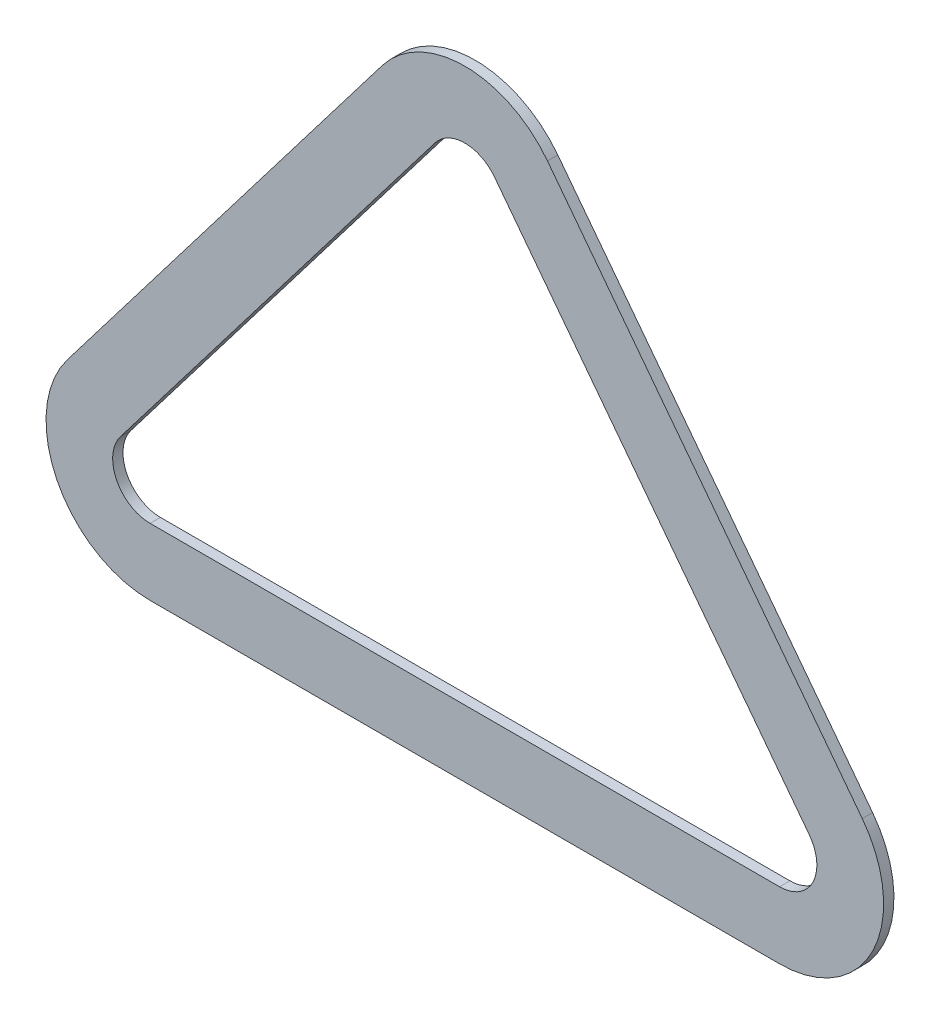
ISO-10303-21;
HEADER;
FILE_DESCRIPTION(('STEP AP214'),'2;1');
FILE_NAME('part.step','',(''),(''),'','','');
FILE_SCHEMA(('AUTOMOTIVE_DESIGN { 1 0 10303 214 1 1 1 1 }'));
ENDSEC;
DATA;
#1=APPLICATION_CONTEXT('core data for automotive mechanical design processes');
#2=APPLICATION_PROTOCOL_DEFINITION('international standard','automotive_design',2000,#1);
#3=PRODUCT_CONTEXT('',#1,'mechanical');
#4=PRODUCT('Part','Part','',(#3));
#5=PRODUCT_RELATED_PRODUCT_CATEGORY('part','',(#4));
#6=PRODUCT_DEFINITION_FORMATION('','',#4);
#7=PRODUCT_DEFINITION_CONTEXT('part definition',#1,'design');
#8=PRODUCT_DEFINITION('design','',#6,#7);
#9=PRODUCT_DEFINITION_SHAPE('','',#8);
#10=(LENGTH_UNIT() NAMED_UNIT(*) SI_UNIT(.MILLI.,.METRE.));
#11=(NAMED_UNIT(*) PLANE_ANGLE_UNIT() SI_UNIT($,.RADIAN.));
#12=(NAMED_UNIT(*) SI_UNIT($,.STERADIAN.) SOLID_ANGLE_UNIT());
#13=UNCERTAINTY_MEASURE_WITH_UNIT(LENGTH_MEASURE(1.E-05),#10,'distance_accuracy_value','');
#14=(GEOMETRIC_REPRESENTATION_CONTEXT(3) GLOBAL_UNCERTAINTY_ASSIGNED_CONTEXT((#13)) GLOBAL_UNIT_ASSIGNED_CONTEXT((#10,
#11,#12)) REPRESENTATION_CONTEXT('',''));
#15=CARTESIAN_POINT('',(0.,0.,0.));
#16=DIRECTION('',(0.,0.,1.));
#17=DIRECTION('',(1.,0.,0.));
#18=AXIS2_PLACEMENT_3D('',#15,#16,#17);
#19=CARTESIAN_POINT('',(0.,0.,0.));
#20=DIRECTION('',(0.,0.,1.));
#21=DIRECTION('',(1.,0.,0.));
#22=AXIS2_PLACEMENT_3D('',#19,#20,#21);
#23=PLANE('',#22);
#24=DIRECTION('',(0.607183709034983,0.794561478730577,0.));
#25=VECTOR('',#24,1.);
#26=CARTESIAN_POINT('',(-1.67,-0.647,0.));
#27=LINE('',#26,#25);
#28=CARTESIAN_POINT('',(-1.67000000000008,-0.646999999999942,0.));
#29=VERTEX_POINT('',#28);
#30=CARTESIAN_POINT('',(-0.146999999999797,1.34599999999985,0.));
#31=VERTEX_POINT('',#30);
#32=EDGE_CURVE('E136',#29,#31,#27,.T.);
#33=ORIENTED_EDGE('',*,*,#32,.F.);
#34=CARTESIAN_POINT('',(-1.526059354807,-0.7569005054714,0.));
#35=DIRECTION('',(0.,0.,1.));
#36=DIRECTION('',(1.,0.,0.));
#37=AXIS2_PLACEMENT_3D('',#34,#35,#36);
#38=CIRCLE('',#37,0.1810995042553);
#39=CARTESIAN_POINT('',(-1.526,-0.938000000000016,0.));
#40=VERTEX_POINT('',#39);
#41=EDGE_CURVE('E144',#29,#40,#38,.T.);
#42=ORIENTED_EDGE('',*,*,#41,.T.);
#43=DIRECTION('',(1.,0.,0.));
#44=VECTOR('',#43,1.);
#45=CARTESIAN_POINT('',(1.52,-0.938,0.));
#46=LINE('',#45,#44);
#47=CARTESIAN_POINT('',(1.52,-0.937999999999984,0.));
#48=VERTEX_POINT('',#47);
#49=EDGE_CURVE('E141',#48,#40,#46,.F.);
#50=ORIENTED_EDGE('',*,*,#49,.F.);
#51=CARTESIAN_POINT('',(1.519559354807,-0.7571477241834,0.));
#52=DIRECTION('',(0.,0.,1.));
#53=DIRECTION('',(1.,0.,0.));
#54=AXIS2_PLACEMENT_3D('',#51,#52,#53);
#55=CIRCLE('',#54,0.1808528126301);
#56=CARTESIAN_POINT('',(1.66300000000001,-0.646999999999992,0.));
#57=VERTEX_POINT('',#56);
#58=EDGE_CURVE('E174',#48,#57,#55,.T.);
#59=ORIENTED_EDGE('',*,*,#58,.T.);
#60=DIRECTION('',(0.606931922260404,-0.794753824615705,0.));
#61=VECTOR('',#60,1.);
#62=CARTESIAN_POINT('',(0.141,1.346,0.));
#63=LINE('',#62,#61);
#64=CARTESIAN_POINT('',(0.140999999999872,1.3459999999999,0.));
#65=VERTEX_POINT('',#64);
#66=EDGE_CURVE('E132',#65,#57,#63,.T.);
#67=ORIENTED_EDGE('',*,*,#66,.F.);
#68=CARTESIAN_POINT('',(-0.003,1.235979293988,0.));
#69=DIRECTION('',(0.,0.,1.));
#70=DIRECTION('',(1.,0.,0.));
#71=AXIS2_PLACEMENT_3D('',#68,#69,#70);
#72=CIRCLE('',#71,0.1812196340115);
#73=EDGE_CURVE('E139',#65,#31,#72,.T.);
#74=ORIENTED_EDGE('',*,*,#73,.T.);
#75=EDGE_LOOP('',(#33,#42,#50,#59,#67,#74));
#76=FACE_BOUND('',#75,.T.);
#77=CARTESIAN_POINT('',(1.520127899652,-0.757675722943,0.));
#78=DIRECTION('',(0.,0.,1.));
#79=DIRECTION('',(1.,0.,0.));
#80=AXIS2_PLACEMENT_3D('',#77,#78,#79);
#81=CIRCLE('',#80,0.5033242933073);
#82=CARTESIAN_POINT('',(1.52,-1.26100000000001,0.));
#83=VERTEX_POINT('',#82);
#84=CARTESIAN_POINT('',(1.91999999999994,-0.452000000000046,0.));
#85=VERTEX_POINT('',#84);
#86=EDGE_CURVE('E118',#83,#85,#81,.T.);
#87=ORIENTED_EDGE('',*,*,#86,.F.);
#88=DIRECTION('',(1.,0.,0.));
#89=VECTOR('',#88,1.);
#90=CARTESIAN_POINT('',(-1.526,-1.261,0.));
#91=LINE('',#90,#89);
#92=CARTESIAN_POINT('',(-1.526,-1.26100000000001,0.));
#93=VERTEX_POINT('',#92);
#94=EDGE_CURVE('E116',#93,#83,#91,.T.);
#95=ORIENTED_EDGE('',*,*,#94,.F.);
#96=CARTESIAN_POINT('',(-1.526127899652,-0.757675722943,0.));
#97=DIRECTION('',(0.,0.,1.));
#98=DIRECTION('',(1.,0.,0.));
#99=AXIS2_PLACEMENT_3D('',#96,#97,#98);
#100=CIRCLE('',#99,0.5033242933073);
#101=CARTESIAN_POINT('',(-1.92599999999997,-0.452000000000021,0.));
#102=VERTEX_POINT('',#101);
#103=EDGE_CURVE('E20',#102,#93,#100,.T.);
#104=ORIENTED_EDGE('',*,*,#103,.F.);
#105=DIRECTION('',(-0.606991412962213,-0.794708389656317,0.));
#106=VECTOR('',#105,1.);
#107=CARTESIAN_POINT('',(-0.403,1.542,0.));
#108=LINE('',#107,#106);
#109=CARTESIAN_POINT('',(-0.403000000000072,1.54200000000006,0.));
#110=VERTEX_POINT('',#109);
#111=EDGE_CURVE('E102',#110,#102,#108,.T.);
#112=ORIENTED_EDGE('',*,*,#111,.F.);
#113=CARTESIAN_POINT('',(-0.003,1.236386927746,0.));
#114=DIRECTION('',(0.,0.,1.));
#115=DIRECTION('',(1.,0.,0.));
#116=AXIS2_PLACEMENT_3D('',#113,#114,#115);
#117=CIRCLE('',#116,0.5033878722543);
#118=CARTESIAN_POINT('',(0.39700000000004,1.54200000000003,0.));
#119=VERTEX_POINT('',#118);
#120=EDGE_CURVE('E176',#119,#110,#117,.T.);
#121=ORIENTED_EDGE('',*,*,#120,.F.);
#122=DIRECTION('',(-0.606991412962213,0.794708389656317,0.));
#123=VECTOR('',#122,1.);
#124=CARTESIAN_POINT('',(1.92,-0.452,0.));
#125=LINE('',#124,#123);
#126=EDGE_CURVE('E146',#85,#119,#125,.T.);
#127=ORIENTED_EDGE('',*,*,#126,.F.);
#128=EDGE_LOOP('',(#87,#95,#104,#112,#121,#127));
#129=FACE_BOUND('',#128,.T.);
#130=ADVANCED_FACE('F17',(#76,#129),#23,.F.);
#131=CARTESIAN_POINT('',(-0.403,1.542,0.));
#132=DIRECTION('',(-0.794708389656317,0.606991412962213,0.));
#133=DIRECTION('',(-0.606991412962213,-0.794708389656317,0.));
#134=AXIS2_PLACEMENT_3D('',#131,#132,#133);
#135=PLANE('',#134);
#136=DIRECTION('',(0.,0.,1.));
#137=VECTOR('',#136,1.);
#138=CARTESIAN_POINT('',(-0.403000000000144,1.54200000000011,0.));
#139=LINE('',#138,#137);
#140=CARTESIAN_POINT('',(-0.403000000000072,1.54200000000006,0.05));
#141=VERTEX_POINT('',#140);
#142=EDGE_CURVE('E148',#110,#141,#139,.T.);
#143=ORIENTED_EDGE('',*,*,#142,.F.);
#144=ORIENTED_EDGE('',*,*,#111,.T.);
#145=DIRECTION('',(0.,0.,1.));
#146=VECTOR('',#145,1.);
#147=CARTESIAN_POINT('',(-1.92599999999988,-0.452000000000093,0.));
#148=LINE('',#147,#146);
#149=CARTESIAN_POINT('',(-1.92599999999991,-0.45200000000007,0.05));
#150=VERTEX_POINT('',#149);
#151=EDGE_CURVE('E113',#150,#102,#148,.F.);
#152=ORIENTED_EDGE('',*,*,#151,.F.);
#153=DIRECTION('',(-0.606991412962187,-0.794708389656337,0.));
#154=VECTOR('',#153,1.);
#155=CARTESIAN_POINT('',(-0.403,1.542,0.05));
#156=LINE('',#155,#154);
#157=EDGE_CURVE('E135',#141,#150,#156,.T.);
#158=ORIENTED_EDGE('',*,*,#157,.F.);
#159=EDGE_LOOP('',(#143,#144,#152,#158));
#160=FACE_BOUND('',#159,.T.);
#161=ADVANCED_FACE('F212',(#160),#135,.T.);
#162=CARTESIAN_POINT('',(-1.526127899652,-0.757675722943,0.));
#163=DIRECTION('',(0.,0.,1.));
#164=DIRECTION('',(1.,0.,0.));
#165=AXIS2_PLACEMENT_3D('',#162,#163,#164);
#166=CYLINDRICAL_SURFACE('',#165,0.5033242933073);
#167=ORIENTED_EDGE('',*,*,#151,.T.);
#168=ORIENTED_EDGE('',*,*,#103,.T.);
#169=DIRECTION('',(0.,0.,-1.));
#170=VECTOR('',#169,1.);
#171=CARTESIAN_POINT('',(-1.526,-1.261,0.));
#172=LINE('',#171,#170);
#173=CARTESIAN_POINT('',(-1.526,-1.261,0.05));
#174=VERTEX_POINT('',#173);
#175=EDGE_CURVE('E111',#174,#93,#172,.T.);
#176=ORIENTED_EDGE('',*,*,#175,.F.);
#177=CARTESIAN_POINT('',(-1.526127899652,-0.757675722943,0.05));
#178=DIRECTION('',(0.,0.,1.));
#179=DIRECTION('',(1.,0.,0.));
#180=AXIS2_PLACEMENT_3D('',#177,#178,#179);
#181=CIRCLE('',#180,0.5033242933073);
#182=EDGE_CURVE('E168',#150,#174,#181,.T.);
#183=ORIENTED_EDGE('',*,*,#182,.F.);
#184=EDGE_LOOP('',(#167,#168,#176,#183));
#185=FACE_BOUND('',#184,.T.);
#186=ADVANCED_FACE('F108',(#185),#166,.T.);
#187=CARTESIAN_POINT('',(-1.526,-1.261,0.));
#188=DIRECTION('',(0.,-1.,0.));
#189=DIRECTION('',(0.,0.,-1.));
#190=AXIS2_PLACEMENT_3D('',#187,#188,#189);
#191=PLANE('',#190);
#192=ORIENTED_EDGE('',*,*,#175,.T.);
#193=ORIENTED_EDGE('',*,*,#94,.T.);
#194=DIRECTION('',(0.,0.,1.));
#195=VECTOR('',#194,1.);
#196=CARTESIAN_POINT('',(1.52,-1.26100000000002,0.));
#197=LINE('',#196,#195);
#198=CARTESIAN_POINT('',(1.52,-1.26100000000002,0.05));
#199=VERTEX_POINT('',#198);
#200=EDGE_CURVE('E121',#199,#83,#197,.F.);
#201=ORIENTED_EDGE('',*,*,#200,.F.);
#202=DIRECTION('',(1.,0.,0.));
#203=VECTOR('',#202,1.);
#204=CARTESIAN_POINT('',(0.,-1.261,0.05));
#205=LINE('',#204,#203);
#206=EDGE_CURVE('E125',#174,#199,#205,.T.);
#207=ORIENTED_EDGE('',*,*,#206,.F.);
#208=EDGE_LOOP('',(#192,#193,#201,#207));
#209=FACE_BOUND('',#208,.T.);
#210=ADVANCED_FACE('F123',(#209),#191,.T.);
#211=CARTESIAN_POINT('',(1.520127899652,-0.757675722943,0.));
#212=DIRECTION('',(0.,0.,1.));
#213=DIRECTION('',(1.,0.,0.));
#214=AXIS2_PLACEMENT_3D('',#211,#212,#213);
#215=CYLINDRICAL_SURFACE('',#214,0.5033242933073);
#216=ORIENTED_EDGE('',*,*,#200,.T.);
#217=ORIENTED_EDGE('',*,*,#86,.T.);
#218=DIRECTION('',(0.,0.,1.));
#219=VECTOR('',#218,1.);
#220=CARTESIAN_POINT('',(1.92,-0.452,0.));
#221=LINE('',#220,#219);
#222=CARTESIAN_POINT('',(1.92,-0.452,0.05));
#223=VERTEX_POINT('',#222);
#224=EDGE_CURVE('E149',#223,#85,#221,.F.);
#225=ORIENTED_EDGE('',*,*,#224,.F.);
#226=CARTESIAN_POINT('',(1.520127899652,-0.757675722943,0.05));
#227=DIRECTION('',(0.,0.,1.));
#228=DIRECTION('',(1.,0.,0.));
#229=AXIS2_PLACEMENT_3D('',#226,#227,#228);
#230=CIRCLE('',#229,0.5033242933073);
#231=EDGE_CURVE('E165',#199,#223,#230,.T.);
#232=ORIENTED_EDGE('',*,*,#231,.F.);
#233=EDGE_LOOP('',(#216,#217,#225,#232));
#234=FACE_BOUND('',#233,.T.);
#235=ADVANCED_FACE('F182',(#234),#215,.T.);
#236=CARTESIAN_POINT('',(1.92,-0.452,0.));
#237=DIRECTION('',(0.794708389656317,0.606991412962213,0.));
#238=DIRECTION('',(-0.606991412962213,0.794708389656317,0.));
#239=AXIS2_PLACEMENT_3D('',#236,#237,#238);
#240=PLANE('',#239);
#241=ORIENTED_EDGE('',*,*,#224,.T.);
#242=ORIENTED_EDGE('',*,*,#126,.T.);
#243=DIRECTION('',(0.,0.,1.));
#244=VECTOR('',#243,1.);
#245=CARTESIAN_POINT('',(0.397000000000144,1.54200000000011,0.));
#246=LINE('',#245,#244);
#247=CARTESIAN_POINT('',(0.397000000000108,1.54200000000008,0.05));
#248=VERTEX_POINT('',#247);
#249=EDGE_CURVE('E178',#248,#119,#246,.F.);
#250=ORIENTED_EDGE('',*,*,#249,.F.);
#251=DIRECTION('',(-0.606991412962187,0.794708389656337,0.));
#252=VECTOR('',#251,1.);
#253=CARTESIAN_POINT('',(1.92,-0.452,0.05));
#254=LINE('',#253,#252);
#255=EDGE_CURVE('E164',#223,#248,#254,.T.);
#256=ORIENTED_EDGE('',*,*,#255,.F.);
#257=EDGE_LOOP('',(#241,#242,#250,#256));
#258=FACE_BOUND('',#257,.T.);
#259=ADVANCED_FACE('F211',(#258),#240,.T.);
#260=CARTESIAN_POINT('',(-0.003,1.236386927746,0.));
#261=DIRECTION('',(0.,0.,1.));
#262=DIRECTION('',(1.,0.,0.));
#263=AXIS2_PLACEMENT_3D('',#260,#261,#262);
#264=CYLINDRICAL_SURFACE('',#263,0.5033878722543);
#265=ORIENTED_EDGE('',*,*,#249,.T.);
#266=ORIENTED_EDGE('',*,*,#120,.T.);
#267=ORIENTED_EDGE('',*,*,#142,.T.);
#268=CARTESIAN_POINT('',(-0.003,1.236386927746,0.05));
#269=DIRECTION('',(0.,0.,1.));
#270=DIRECTION('',(1.,0.,0.));
#271=AXIS2_PLACEMENT_3D('',#268,#269,#270);
#272=CIRCLE('',#271,0.5033878722543);
#273=EDGE_CURVE('E161',#248,#141,#272,.T.);
#274=ORIENTED_EDGE('',*,*,#273,.F.);
#275=EDGE_LOOP('',(#265,#266,#267,#274));
#276=FACE_BOUND('',#275,.T.);
#277=ADVANCED_FACE('F208',(#276),#264,.T.);
#278=CARTESIAN_POINT('',(1.519559354807,-0.7571477241834,0.));
#279=DIRECTION('',(0.,0.,1.));
#280=DIRECTION('',(1.,0.,0.));
#281=AXIS2_PLACEMENT_3D('',#278,#279,#280);
#282=CYLINDRICAL_SURFACE('',#281,0.1808528126301);
#283=CARTESIAN_POINT('',(1.519559354807,-0.7571477241834,0.05));
#284=DIRECTION('',(0.,0.,1.));
#285=DIRECTION('',(1.,0.,0.));
#286=AXIS2_PLACEMENT_3D('',#283,#284,#285);
#287=CIRCLE('',#286,0.1808528126301);
#288=CARTESIAN_POINT('',(1.66300000000001,-0.646999999999992,0.05));
#289=VERTEX_POINT('',#288);
#290=CARTESIAN_POINT('',(1.52,-0.938,0.05));
#291=VERTEX_POINT('',#290);
#292=EDGE_CURVE('E158',#289,#291,#287,.F.);
#293=ORIENTED_EDGE('',*,*,#292,.F.);
#294=DIRECTION('',(0.,0.,1.));
#295=VECTOR('',#294,1.);
#296=CARTESIAN_POINT('',(1.66299999999991,-0.647000000000072,0.));
#297=LINE('',#296,#295);
#298=EDGE_CURVE('E194',#57,#289,#297,.T.);
#299=ORIENTED_EDGE('',*,*,#298,.F.);
#300=ORIENTED_EDGE('',*,*,#58,.F.);
#301=DIRECTION('',(0.,0.,1.));
#302=VECTOR('',#301,1.);
#303=CARTESIAN_POINT('',(1.52,-0.938,0.));
#304=LINE('',#303,#302);
#305=EDGE_CURVE('E145',#291,#48,#304,.F.);
#306=ORIENTED_EDGE('',*,*,#305,.F.);
#307=EDGE_LOOP('',(#293,#299,#300,#306));
#308=FACE_BOUND('',#307,.T.);
#309=ADVANCED_FACE('F245',(#308),#282,.F.);
#310=CARTESIAN_POINT('',(1.52,-0.938,0.));
#311=DIRECTION('',(0.,1.,0.));
#312=DIRECTION('',(0.,0.,1.));
#313=AXIS2_PLACEMENT_3D('',#310,#311,#312);
#314=PLANE('',#313);
#315=ORIENTED_EDGE('',*,*,#305,.T.);
#316=ORIENTED_EDGE('',*,*,#49,.T.);
#317=DIRECTION('',(0.,0.,1.));
#318=VECTOR('',#317,1.);
#319=CARTESIAN_POINT('',(-1.526,-0.938000000000022,0.));
#320=LINE('',#319,#318);
#321=CARTESIAN_POINT('',(-1.526,-0.938000000000016,0.05));
#322=VERTEX_POINT('',#321);
#323=EDGE_CURVE('E173',#40,#322,#320,.T.);
#324=ORIENTED_EDGE('',*,*,#323,.T.);
#325=DIRECTION('',(1.,0.,0.));
#326=VECTOR('',#325,1.);
#327=CARTESIAN_POINT('',(0.,-0.938,0.05));
#328=LINE('',#327,#326);
#329=EDGE_CURVE('E157',#291,#322,#328,.F.);
#330=ORIENTED_EDGE('',*,*,#329,.F.);
#331=EDGE_LOOP('',(#315,#316,#324,#330));
#332=FACE_BOUND('',#331,.T.);
#333=ADVANCED_FACE('F241',(#332),#314,.T.);
#334=CARTESIAN_POINT('',(-1.526059354807,-0.7569005054714,0.));
#335=DIRECTION('',(0.,0.,1.));
#336=DIRECTION('',(1.,0.,0.));
#337=AXIS2_PLACEMENT_3D('',#334,#335,#336);
#338=CYLINDRICAL_SURFACE('',#337,0.1810995042553);
#339=CARTESIAN_POINT('',(-1.526059354807,-0.7569005054714,0.05));
#340=DIRECTION('',(0.,0.,1.));
#341=DIRECTION('',(1.,0.,0.));
#342=AXIS2_PLACEMENT_3D('',#339,#340,#341);
#343=CIRCLE('',#342,0.1810995042553);
#344=CARTESIAN_POINT('',(-1.67,-0.647,0.05));
#345=VERTEX_POINT('',#344);
#346=EDGE_CURVE('E154',#322,#345,#343,.F.);
#347=ORIENTED_EDGE('',*,*,#346,.F.);
#348=ORIENTED_EDGE('',*,*,#323,.F.);
#349=ORIENTED_EDGE('',*,*,#41,.F.);
#350=DIRECTION('',(0.,0.,1.));
#351=VECTOR('',#350,1.);
#352=CARTESIAN_POINT('',(-1.67,-0.647,0.));
#353=LINE('',#352,#351);
#354=EDGE_CURVE('E140',#345,#29,#353,.F.);
#355=ORIENTED_EDGE('',*,*,#354,.F.);
#356=EDGE_LOOP('',(#347,#348,#349,#355));
#357=FACE_BOUND('',#356,.T.);
#358=ADVANCED_FACE('F237',(#357),#338,.F.);
#359=CARTESIAN_POINT('',(-1.67,-0.647,0.));
#360=DIRECTION('',(0.794561478730577,-0.607183709034983,0.));
#361=DIRECTION('',(0.607183709034983,0.794561478730577,0.));
#362=AXIS2_PLACEMENT_3D('',#359,#360,#361);
#363=PLANE('',#362);
#364=ORIENTED_EDGE('',*,*,#354,.T.);
#365=ORIENTED_EDGE('',*,*,#32,.T.);
#366=DIRECTION('',(0.,0.,1.));
#367=VECTOR('',#366,1.);
#368=CARTESIAN_POINT('',(-0.146999999999744,1.3459999999998,0.));
#369=LINE('',#368,#367);
#370=CARTESIAN_POINT('',(-0.146999999999808,1.34599999999985,0.05));
#371=VERTEX_POINT('',#370);
#372=EDGE_CURVE('E171',#31,#371,#369,.T.);
#373=ORIENTED_EDGE('',*,*,#372,.T.);
#374=DIRECTION('',(0.607183709034966,0.79456147873059,0.));
#375=VECTOR('',#374,1.);
#376=CARTESIAN_POINT('',(-1.67,-0.647,0.05));
#377=LINE('',#376,#375);
#378=EDGE_CURVE('E153',#345,#371,#377,.T.);
#379=ORIENTED_EDGE('',*,*,#378,.F.);
#380=EDGE_LOOP('',(#364,#365,#373,#379));
#381=FACE_BOUND('',#380,.T.);
#382=ADVANCED_FACE('F234',(#381),#363,.T.);
#383=CARTESIAN_POINT('',(-0.003,1.235979293988,0.));
#384=DIRECTION('',(0.,0.,1.));
#385=DIRECTION('',(1.,0.,0.));
#386=AXIS2_PLACEMENT_3D('',#383,#384,#385);
#387=CYLINDRICAL_SURFACE('',#386,0.1812196340115);
#388=CARTESIAN_POINT('',(-0.003,1.235979293988,0.05));
#389=DIRECTION('',(0.,0.,1.));
#390=DIRECTION('',(1.,0.,0.));
#391=AXIS2_PLACEMENT_3D('',#388,#389,#390);
#392=CIRCLE('',#391,0.1812196340115);
#393=CARTESIAN_POINT('',(0.141,1.346,0.05));
#394=VERTEX_POINT('',#393);
#395=EDGE_CURVE('E26',#371,#394,#392,.F.);
#396=ORIENTED_EDGE('',*,*,#395,.F.);
#397=ORIENTED_EDGE('',*,*,#372,.F.);
#398=ORIENTED_EDGE('',*,*,#73,.F.);
#399=DIRECTION('',(0.,0.,1.));
#400=VECTOR('',#399,1.);
#401=CARTESIAN_POINT('',(0.141,1.346,0.));
#402=LINE('',#401,#400);
#403=EDGE_CURVE('E35',#394,#65,#402,.F.);
#404=ORIENTED_EDGE('',*,*,#403,.F.);
#405=EDGE_LOOP('',(#396,#397,#398,#404));
#406=FACE_BOUND('',#405,.T.);
#407=ADVANCED_FACE('F228',(#406),#387,.F.);
#408=CARTESIAN_POINT('',(0.141,1.346,0.));
#409=DIRECTION('',(-0.794753824615705,-0.606931922260404,0.));
#410=DIRECTION('',(0.606931922260404,-0.794753824615705,0.));
#411=AXIS2_PLACEMENT_3D('',#408,#409,#410);
#412=PLANE('',#411);
#413=ORIENTED_EDGE('',*,*,#403,.T.);
#414=ORIENTED_EDGE('',*,*,#66,.T.);
#415=ORIENTED_EDGE('',*,*,#298,.T.);
#416=DIRECTION('',(0.606931922260441,-0.794753824615677,0.));
#417=VECTOR('',#416,1.);
#418=CARTESIAN_POINT('',(0.141,1.346,0.05));
#419=LINE('',#418,#417);
#420=EDGE_CURVE('E11',#394,#289,#419,.T.);
#421=ORIENTED_EDGE('',*,*,#420,.F.);
#422=EDGE_LOOP('',(#413,#414,#415,#421));
#423=FACE_BOUND('',#422,.T.);
#424=ADVANCED_FACE('F222',(#423),#412,.T.);
#425=CARTESIAN_POINT('',(0.,0.,0.05));
#426=DIRECTION('',(0.,0.,1.));
#427=DIRECTION('',(1.,0.,0.));
#428=AXIS2_PLACEMENT_3D('',#425,#426,#427);
#429=PLANE('',#428);
#430=ORIENTED_EDGE('',*,*,#395,.T.);
#431=ORIENTED_EDGE('',*,*,#420,.T.);
#432=ORIENTED_EDGE('',*,*,#292,.T.);
#433=ORIENTED_EDGE('',*,*,#329,.T.);
#434=ORIENTED_EDGE('',*,*,#346,.T.);
#435=ORIENTED_EDGE('',*,*,#378,.T.);
#436=EDGE_LOOP('',(#430,#431,#432,#433,#434,#435));
#437=FACE_BOUND('',#436,.T.);
#438=ORIENTED_EDGE('',*,*,#255,.T.);
#439=ORIENTED_EDGE('',*,*,#273,.T.);
#440=ORIENTED_EDGE('',*,*,#157,.T.);
#441=ORIENTED_EDGE('',*,*,#182,.T.);
#442=ORIENTED_EDGE('',*,*,#206,.T.);
#443=ORIENTED_EDGE('',*,*,#231,.T.);
#444=EDGE_LOOP('',(#438,#439,#440,#441,#442,#443));
#445=FACE_BOUND('',#444,.T.);
#446=ADVANCED_FACE('F186',(#437,#445),#429,.T.);
#447=CLOSED_SHELL('',(#130,#161,#186,#210,#235,#259,#277,#309,#333,#358,#382,#407,#424,#446));
#448=MANIFOLD_SOLID_BREP('B1',#447);
#449=ADVANCED_BREP_SHAPE_REPRESENTATION('',(#18,#448),#14);
#450=SHAPE_DEFINITION_REPRESENTATION(#9,#449);
ENDSEC;
END-ISO-10303-21;
